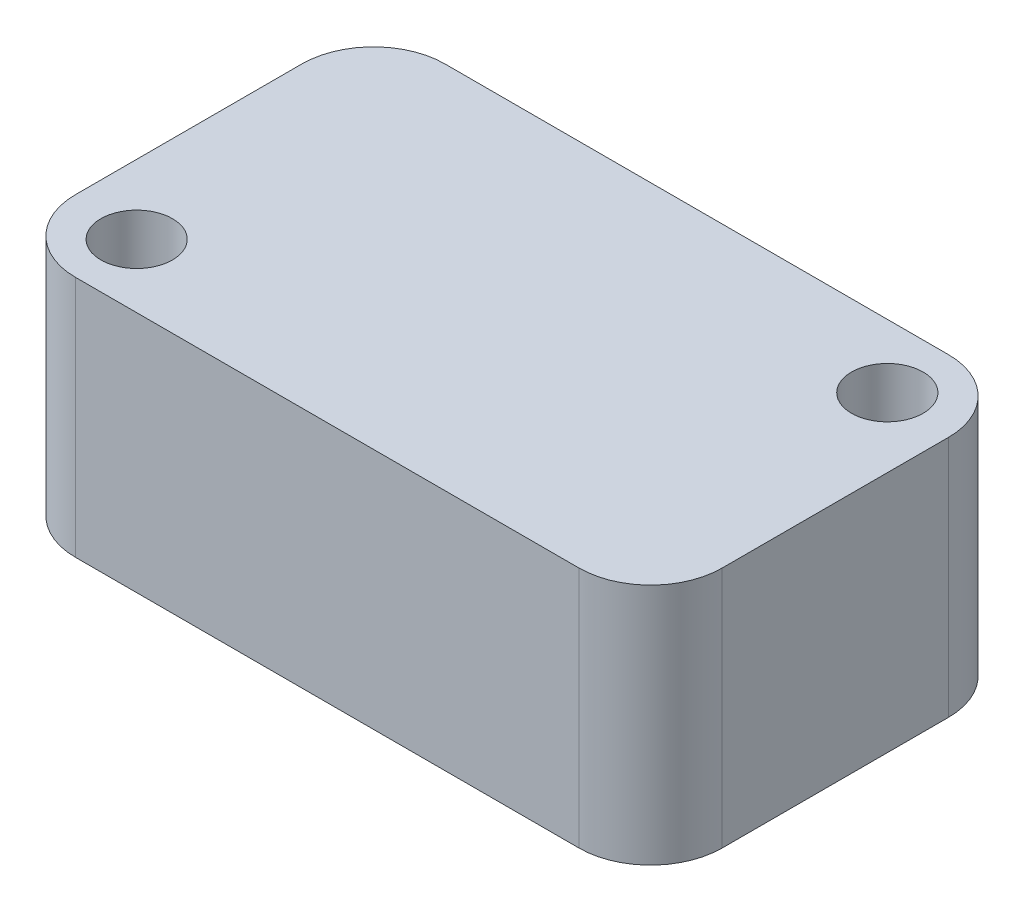
ISO-10303-21;
HEADER;
FILE_DESCRIPTION(('STEP AP214'),'2;1');
FILE_NAME('part.step','',(''),(''),'','','');
FILE_SCHEMA(('AUTOMOTIVE_DESIGN { 1 0 10303 214 1 1 1 1 }'));
ENDSEC;
DATA;
#1=APPLICATION_CONTEXT('core data for automotive mechanical design processes');
#2=APPLICATION_PROTOCOL_DEFINITION('international standard','automotive_design',2000,#1);
#3=PRODUCT_CONTEXT('',#1,'mechanical');
#4=PRODUCT('Part','Part','',(#3));
#5=PRODUCT_RELATED_PRODUCT_CATEGORY('part','',(#4));
#6=PRODUCT_DEFINITION_FORMATION('','',#4);
#7=PRODUCT_DEFINITION_CONTEXT('part definition',#1,'design');
#8=PRODUCT_DEFINITION('design','',#6,#7);
#9=PRODUCT_DEFINITION_SHAPE('','',#8);
#10=(LENGTH_UNIT() NAMED_UNIT(*) SI_UNIT(.MILLI.,.METRE.));
#11=(NAMED_UNIT(*) PLANE_ANGLE_UNIT() SI_UNIT($,.RADIAN.));
#12=(NAMED_UNIT(*) SI_UNIT($,.STERADIAN.) SOLID_ANGLE_UNIT());
#13=UNCERTAINTY_MEASURE_WITH_UNIT(LENGTH_MEASURE(1.E-05),#10,'distance_accuracy_value','');
#14=(GEOMETRIC_REPRESENTATION_CONTEXT(3) GLOBAL_UNCERTAINTY_ASSIGNED_CONTEXT((#13)) GLOBAL_UNIT_ASSIGNED_CONTEXT((#10,
#11,#12)) REPRESENTATION_CONTEXT('',''));
#15=CARTESIAN_POINT('',(0.,0.,0.));
#16=DIRECTION('',(0.,0.,1.));
#17=DIRECTION('',(1.,0.,0.));
#18=AXIS2_PLACEMENT_3D('',#15,#16,#17);
#19=CARTESIAN_POINT('',(10.9,10.5,-4.9));
#20=DIRECTION('',(0.,1.,0.));
#21=DIRECTION('',(0.,0.,1.));
#22=AXIS2_PLACEMENT_3D('',#19,#20,#21);
#23=PLANE('',#22);
#24=CARTESIAN_POINT('',(10.9999999999999,10.5,-5.25));
#25=DIRECTION('',(0.,1.,0.));
#26=DIRECTION('',(0.,0.,1.));
#27=AXIS2_PLACEMENT_3D('',#24,#25,#26);
#28=CIRCLE('',#27,1.55);
#29=CARTESIAN_POINT('',(10.9999999999999,10.5,-6.8));
#30=VERTEX_POINT('',#29);
#31=EDGE_CURVE('E134',#30,#30,#28,.T.);
#32=ORIENTED_EDGE('',*,*,#31,.F.);
#33=EDGE_LOOP('',(#32));
#34=FACE_BOUND('',#33,.T.);
#35=CARTESIAN_POINT('',(10.9,10.5,-4.9));
#36=DIRECTION('',(0.,1.,0.));
#37=DIRECTION('',(0.,0.,1.));
#38=AXIS2_PLACEMENT_3D('',#35,#36,#37);
#39=CIRCLE('',#38,3.1);
#40=CARTESIAN_POINT('',(14.,10.5,-4.9));
#41=VERTEX_POINT('',#40);
#42=CARTESIAN_POINT('',(10.9,10.5,-8.));
#43=VERTEX_POINT('',#42);
#44=EDGE_CURVE('E145',#41,#43,#39,.T.);
#45=ORIENTED_EDGE('',*,*,#44,.T.);
#46=DIRECTION('',(-1.,0.,0.));
#47=VECTOR('',#46,1.);
#48=CARTESIAN_POINT('',(-10.9,10.5,-8.));
#49=LINE('',#48,#47);
#50=CARTESIAN_POINT('',(-10.9,10.5,-8.));
#51=VERTEX_POINT('',#50);
#52=EDGE_CURVE('E93',#43,#51,#49,.T.);
#53=ORIENTED_EDGE('',*,*,#52,.T.);
#54=CARTESIAN_POINT('',(-10.9,10.5,-4.9));
#55=DIRECTION('',(0.,1.,0.));
#56=DIRECTION('',(0.,0.,-1.));
#57=AXIS2_PLACEMENT_3D('',#54,#55,#56);
#58=CIRCLE('',#57,3.1);
#59=CARTESIAN_POINT('',(-14.,10.5,-4.9));
#60=VERTEX_POINT('',#59);
#61=EDGE_CURVE('E160',#51,#60,#58,.T.);
#62=ORIENTED_EDGE('',*,*,#61,.T.);
#63=DIRECTION('',(0.,0.,1.));
#64=VECTOR('',#63,1.);
#65=CARTESIAN_POINT('',(-14.,10.5,4.9));
#66=LINE('',#65,#64);
#67=CARTESIAN_POINT('',(-14.,10.5,4.9));
#68=VERTEX_POINT('',#67);
#69=EDGE_CURVE('E173',#60,#68,#66,.T.);
#70=ORIENTED_EDGE('',*,*,#69,.T.);
#71=CARTESIAN_POINT('',(-10.9,10.5,4.9));
#72=DIRECTION('',(0.,1.,0.));
#73=DIRECTION('',(0.,0.,1.));
#74=AXIS2_PLACEMENT_3D('',#71,#72,#73);
#75=CIRCLE('',#74,3.1);
#76=CARTESIAN_POINT('',(-10.9,10.5,8.));
#77=VERTEX_POINT('',#76);
#78=EDGE_CURVE('E112',#68,#77,#75,.T.);
#79=ORIENTED_EDGE('',*,*,#78,.T.);
#80=DIRECTION('',(1.,0.,0.));
#81=VECTOR('',#80,1.);
#82=CARTESIAN_POINT('',(-10.9,10.5,8.));
#83=LINE('',#82,#81);
#84=CARTESIAN_POINT('',(10.9,10.5,8.));
#85=VERTEX_POINT('',#84);
#86=EDGE_CURVE('E106',#77,#85,#83,.T.);
#87=ORIENTED_EDGE('',*,*,#86,.T.);
#88=CARTESIAN_POINT('',(10.9,10.5,4.9));
#89=DIRECTION('',(0.,1.,0.));
#90=DIRECTION('',(0.,0.,1.));
#91=AXIS2_PLACEMENT_3D('',#88,#89,#90);
#92=CIRCLE('',#91,3.1);
#93=CARTESIAN_POINT('',(14.,10.5,4.9));
#94=VERTEX_POINT('',#93);
#95=EDGE_CURVE('E110',#85,#94,#92,.T.);
#96=ORIENTED_EDGE('',*,*,#95,.T.);
#97=DIRECTION('',(0.,0.,-1.));
#98=VECTOR('',#97,1.);
#99=CARTESIAN_POINT('',(14.,10.5,4.9));
#100=LINE('',#99,#98);
#101=EDGE_CURVE('E50',#94,#41,#100,.T.);
#102=ORIENTED_EDGE('',*,*,#101,.T.);
#103=EDGE_LOOP('',(#45,#53,#62,#70,#79,#87,#96,#102));
#104=FACE_BOUND('',#103,.T.);
#105=CARTESIAN_POINT('',(-10.9999999999999,10.5,5.25));
#106=DIRECTION('',(0.,1.,0.));
#107=DIRECTION('',(0.,0.,1.));
#108=AXIS2_PLACEMENT_3D('',#105,#106,#107);
#109=CIRCLE('',#108,1.55);
#110=CARTESIAN_POINT('',(-10.9999999999999,10.5,3.69999999999999));
#111=VERTEX_POINT('',#110);
#112=EDGE_CURVE('E182',#111,#111,#109,.T.);
#113=ORIENTED_EDGE('',*,*,#112,.F.);
#114=EDGE_LOOP('',(#113));
#115=FACE_BOUND('',#114,.T.);
#116=ADVANCED_FACE('F33',(#34,#104,#115),#23,.T.);
#117=CARTESIAN_POINT('',(10.9,0.,-4.9));
#118=DIRECTION('',(0.,1.,0.));
#119=DIRECTION('',(0.,0.,1.));
#120=AXIS2_PLACEMENT_3D('',#117,#118,#119);
#121=PLANE('',#120);
#122=CARTESIAN_POINT('',(10.9,0.,-4.9));
#123=DIRECTION('',(0.,1.,0.));
#124=DIRECTION('',(0.,0.,1.));
#125=AXIS2_PLACEMENT_3D('',#122,#123,#124);
#126=CIRCLE('',#125,3.1);
#127=CARTESIAN_POINT('',(14.,0.,-4.9));
#128=VERTEX_POINT('',#127);
#129=CARTESIAN_POINT('',(10.9,0.,-8.));
#130=VERTEX_POINT('',#129);
#131=EDGE_CURVE('E130',#128,#130,#126,.T.);
#132=ORIENTED_EDGE('',*,*,#131,.F.);
#133=DIRECTION('',(0.,0.,-1.));
#134=VECTOR('',#133,1.);
#135=CARTESIAN_POINT('',(14.,0.,4.9));
#136=LINE('',#135,#134);
#137=CARTESIAN_POINT('',(14.,0.,4.9));
#138=VERTEX_POINT('',#137);
#139=EDGE_CURVE('E85',#138,#128,#136,.T.);
#140=ORIENTED_EDGE('',*,*,#139,.F.);
#141=CARTESIAN_POINT('',(10.9,0.,4.9));
#142=DIRECTION('',(0.,1.,0.));
#143=DIRECTION('',(0.,0.,1.));
#144=AXIS2_PLACEMENT_3D('',#141,#142,#143);
#145=CIRCLE('',#144,3.1);
#146=CARTESIAN_POINT('',(10.9,0.,8.));
#147=VERTEX_POINT('',#146);
#148=EDGE_CURVE('E79',#147,#138,#145,.T.);
#149=ORIENTED_EDGE('',*,*,#148,.F.);
#150=DIRECTION('',(1.,0.,0.));
#151=VECTOR('',#150,1.);
#152=CARTESIAN_POINT('',(-10.9,0.,8.));
#153=LINE('',#152,#151);
#154=CARTESIAN_POINT('',(-10.9,0.,8.));
#155=VERTEX_POINT('',#154);
#156=EDGE_CURVE('E120',#155,#147,#153,.T.);
#157=ORIENTED_EDGE('',*,*,#156,.F.);
#158=CARTESIAN_POINT('',(-10.9,0.,4.9));
#159=DIRECTION('',(0.,1.,0.));
#160=DIRECTION('',(0.,0.,1.));
#161=AXIS2_PLACEMENT_3D('',#158,#159,#160);
#162=CIRCLE('',#161,3.1);
#163=CARTESIAN_POINT('',(-14.,0.,4.9));
#164=VERTEX_POINT('',#163);
#165=EDGE_CURVE('E140',#164,#155,#162,.T.);
#166=ORIENTED_EDGE('',*,*,#165,.F.);
#167=DIRECTION('',(0.,0.,1.));
#168=VECTOR('',#167,1.);
#169=CARTESIAN_POINT('',(-14.,0.,4.9));
#170=LINE('',#169,#168);
#171=CARTESIAN_POINT('',(-14.,0.,-4.9));
#172=VERTEX_POINT('',#171);
#173=EDGE_CURVE('E138',#172,#164,#170,.T.);
#174=ORIENTED_EDGE('',*,*,#173,.F.);
#175=CARTESIAN_POINT('',(-10.9,0.,-4.9));
#176=DIRECTION('',(0.,1.,0.));
#177=DIRECTION('',(0.,0.,-1.));
#178=AXIS2_PLACEMENT_3D('',#175,#176,#177);
#179=CIRCLE('',#178,3.1);
#180=CARTESIAN_POINT('',(-10.9,0.,-8.));
#181=VERTEX_POINT('',#180);
#182=EDGE_CURVE('E136',#181,#172,#179,.T.);
#183=ORIENTED_EDGE('',*,*,#182,.F.);
#184=DIRECTION('',(-1.,0.,0.));
#185=VECTOR('',#184,1.);
#186=CARTESIAN_POINT('',(-10.9,0.,-8.));
#187=LINE('',#186,#185);
#188=EDGE_CURVE('E133',#130,#181,#187,.T.);
#189=ORIENTED_EDGE('',*,*,#188,.F.);
#190=EDGE_LOOP('',(#132,#140,#149,#157,#166,#174,#183,#189));
#191=FACE_BOUND('',#190,.T.);
#192=CARTESIAN_POINT('',(10.9999999999999,0.,-5.25));
#193=DIRECTION('',(0.,1.,0.));
#194=DIRECTION('',(0.,0.,1.));
#195=AXIS2_PLACEMENT_3D('',#192,#193,#194);
#196=CIRCLE('',#195,1.55);
#197=CARTESIAN_POINT('',(10.9999999999999,0.,-6.8));
#198=VERTEX_POINT('',#197);
#199=EDGE_CURVE('E179',#198,#198,#196,.T.);
#200=ORIENTED_EDGE('',*,*,#199,.T.);
#201=EDGE_LOOP('',(#200));
#202=FACE_BOUND('',#201,.T.);
#203=CARTESIAN_POINT('',(-10.9999999999999,0.,5.25));
#204=DIRECTION('',(0.,1.,0.));
#205=DIRECTION('',(0.,0.,1.));
#206=AXIS2_PLACEMENT_3D('',#203,#204,#205);
#207=CIRCLE('',#206,1.55);
#208=CARTESIAN_POINT('',(-10.9999999999999,0.,3.69999999999999));
#209=VERTEX_POINT('',#208);
#210=EDGE_CURVE('E185',#209,#209,#207,.T.);
#211=ORIENTED_EDGE('',*,*,#210,.T.);
#212=EDGE_LOOP('',(#211));
#213=FACE_BOUND('',#212,.T.);
#214=ADVANCED_FACE('F164',(#191,#202,#213),#121,.F.);
#215=CARTESIAN_POINT('',(10.9,10.5,-4.9));
#216=DIRECTION('',(0.,-1.,0.));
#217=DIRECTION('',(0.,0.,-1.));
#218=AXIS2_PLACEMENT_3D('',#215,#216,#217);
#219=CYLINDRICAL_SURFACE('',#218,3.1);
#220=ORIENTED_EDGE('',*,*,#131,.T.);
#221=DIRECTION('',(0.,-1.,0.));
#222=VECTOR('',#221,1.);
#223=CARTESIAN_POINT('',(10.9,10.5,-8.));
#224=LINE('',#223,#222);
#225=EDGE_CURVE('E11',#43,#130,#224,.T.);
#226=ORIENTED_EDGE('',*,*,#225,.F.);
#227=ORIENTED_EDGE('',*,*,#44,.F.);
#228=DIRECTION('',(0.,-1.,0.));
#229=VECTOR('',#228,1.);
#230=CARTESIAN_POINT('',(14.,10.5,-4.9));
#231=LINE('',#230,#229);
#232=EDGE_CURVE('E126',#41,#128,#231,.T.);
#233=ORIENTED_EDGE('',*,*,#232,.T.);
#234=EDGE_LOOP('',(#220,#226,#227,#233));
#235=FACE_BOUND('',#234,.T.);
#236=ADVANCED_FACE('F35',(#235),#219,.T.);
#237=CARTESIAN_POINT('',(-10.9,10.5,-8.));
#238=DIRECTION('',(0.,0.,1.));
#239=DIRECTION('',(1.,0.,0.));
#240=AXIS2_PLACEMENT_3D('',#237,#238,#239);
#241=PLANE('',#240);
#242=ORIENTED_EDGE('',*,*,#188,.T.);
#243=DIRECTION('',(0.,-1.,0.));
#244=VECTOR('',#243,1.);
#245=CARTESIAN_POINT('',(-10.9,10.5,-8.));
#246=LINE('',#245,#244);
#247=EDGE_CURVE('E42',#51,#181,#246,.T.);
#248=ORIENTED_EDGE('',*,*,#247,.F.);
#249=ORIENTED_EDGE('',*,*,#52,.F.);
#250=ORIENTED_EDGE('',*,*,#225,.T.);
#251=EDGE_LOOP('',(#242,#248,#249,#250));
#252=FACE_BOUND('',#251,.T.);
#253=ADVANCED_FACE('F217',(#252),#241,.F.);
#254=CARTESIAN_POINT('',(-10.9,10.5,-4.9));
#255=DIRECTION('',(0.,-1.,0.));
#256=DIRECTION('',(0.,0.,-1.));
#257=AXIS2_PLACEMENT_3D('',#254,#255,#256);
#258=CYLINDRICAL_SURFACE('',#257,3.1);
#259=ORIENTED_EDGE('',*,*,#182,.T.);
#260=DIRECTION('',(0.,-1.,0.));
#261=VECTOR('',#260,1.);
#262=CARTESIAN_POINT('',(-14.,10.5,-4.9));
#263=LINE('',#262,#261);
#264=EDGE_CURVE('E152',#60,#172,#263,.T.);
#265=ORIENTED_EDGE('',*,*,#264,.F.);
#266=ORIENTED_EDGE('',*,*,#61,.F.);
#267=ORIENTED_EDGE('',*,*,#247,.T.);
#268=EDGE_LOOP('',(#259,#265,#266,#267));
#269=FACE_BOUND('',#268,.T.);
#270=ADVANCED_FACE('F158',(#269),#258,.T.);
#271=CARTESIAN_POINT('',(-14.,10.5,4.9));
#272=DIRECTION('',(1.,0.,0.));
#273=DIRECTION('',(0.,0.,-1.));
#274=AXIS2_PLACEMENT_3D('',#271,#272,#273);
#275=PLANE('',#274);
#276=ORIENTED_EDGE('',*,*,#173,.T.);
#277=DIRECTION('',(0.,-1.,0.));
#278=VECTOR('',#277,1.);
#279=CARTESIAN_POINT('',(-14.,10.5,4.9));
#280=LINE('',#279,#278);
#281=EDGE_CURVE('E149',#68,#164,#280,.T.);
#282=ORIENTED_EDGE('',*,*,#281,.F.);
#283=ORIENTED_EDGE('',*,*,#69,.F.);
#284=ORIENTED_EDGE('',*,*,#264,.T.);
#285=EDGE_LOOP('',(#276,#282,#283,#284));
#286=FACE_BOUND('',#285,.T.);
#287=ADVANCED_FACE('F169',(#286),#275,.F.);
#288=CARTESIAN_POINT('',(-10.9,10.5,4.9));
#289=DIRECTION('',(0.,-1.,0.));
#290=DIRECTION('',(0.,0.,-1.));
#291=AXIS2_PLACEMENT_3D('',#288,#289,#290);
#292=CYLINDRICAL_SURFACE('',#291,3.1);
#293=ORIENTED_EDGE('',*,*,#165,.T.);
#294=DIRECTION('',(0.,-1.,0.));
#295=VECTOR('',#294,1.);
#296=CARTESIAN_POINT('',(-10.9,10.5,8.));
#297=LINE('',#296,#295);
#298=EDGE_CURVE('E121',#77,#155,#297,.T.);
#299=ORIENTED_EDGE('',*,*,#298,.F.);
#300=ORIENTED_EDGE('',*,*,#78,.F.);
#301=ORIENTED_EDGE('',*,*,#281,.T.);
#302=EDGE_LOOP('',(#293,#299,#300,#301));
#303=FACE_BOUND('',#302,.T.);
#304=ADVANCED_FACE('F172',(#303),#292,.T.);
#305=CARTESIAN_POINT('',(-10.9,10.5,8.));
#306=DIRECTION('',(0.,0.,-1.));
#307=DIRECTION('',(-1.,0.,0.));
#308=AXIS2_PLACEMENT_3D('',#305,#306,#307);
#309=PLANE('',#308);
#310=ORIENTED_EDGE('',*,*,#156,.T.);
#311=DIRECTION('',(0.,-1.,0.));
#312=VECTOR('',#311,1.);
#313=CARTESIAN_POINT('',(10.9,10.5,8.));
#314=LINE('',#313,#312);
#315=EDGE_CURVE('E117',#85,#147,#314,.T.);
#316=ORIENTED_EDGE('',*,*,#315,.F.);
#317=ORIENTED_EDGE('',*,*,#86,.F.);
#318=ORIENTED_EDGE('',*,*,#298,.T.);
#319=EDGE_LOOP('',(#310,#316,#317,#318));
#320=FACE_BOUND('',#319,.T.);
#321=ADVANCED_FACE('F118',(#320),#309,.F.);
#322=CARTESIAN_POINT('',(10.9,10.5,4.9));
#323=DIRECTION('',(0.,-1.,0.));
#324=DIRECTION('',(0.,0.,-1.));
#325=AXIS2_PLACEMENT_3D('',#322,#323,#324);
#326=CYLINDRICAL_SURFACE('',#325,3.1);
#327=ORIENTED_EDGE('',*,*,#148,.T.);
#328=DIRECTION('',(0.,-1.,0.));
#329=VECTOR('',#328,1.);
#330=CARTESIAN_POINT('',(14.,10.5,4.9));
#331=LINE('',#330,#329);
#332=EDGE_CURVE('E122',#94,#138,#331,.T.);
#333=ORIENTED_EDGE('',*,*,#332,.F.);
#334=ORIENTED_EDGE('',*,*,#95,.F.);
#335=ORIENTED_EDGE('',*,*,#315,.T.);
#336=EDGE_LOOP('',(#327,#333,#334,#335));
#337=FACE_BOUND('',#336,.T.);
#338=ADVANCED_FACE('F124',(#337),#326,.T.);
#339=CARTESIAN_POINT('',(14.,10.5,4.9));
#340=DIRECTION('',(-1.,0.,0.));
#341=DIRECTION('',(0.,0.,1.));
#342=AXIS2_PLACEMENT_3D('',#339,#340,#341);
#343=PLANE('',#342);
#344=ORIENTED_EDGE('',*,*,#139,.T.);
#345=ORIENTED_EDGE('',*,*,#232,.F.);
#346=ORIENTED_EDGE('',*,*,#101,.F.);
#347=ORIENTED_EDGE('',*,*,#332,.T.);
#348=EDGE_LOOP('',(#344,#345,#346,#347));
#349=FACE_BOUND('',#348,.T.);
#350=ADVANCED_FACE('F205',(#349),#343,.F.);
#351=CARTESIAN_POINT('',(10.9999999999999,10.5,-5.25));
#352=DIRECTION('',(0.,-1.,0.));
#353=DIRECTION('',(0.,0.,-1.));
#354=AXIS2_PLACEMENT_3D('',#351,#352,#353);
#355=CYLINDRICAL_SURFACE('',#354,1.55);
#356=CARTESIAN_POINT('',(10.9999999999999,10.5,-6.8));
#357=CARTESIAN_POINT('',(10.9999999999999,10.390625,-6.8));
#358=CARTESIAN_POINT('',(10.9999999999999,10.28125,-6.8));
#359=CARTESIAN_POINT('',(10.9999999999999,10.0625,-6.8));
#360=CARTESIAN_POINT('',(10.9999999999999,9.953125,-6.8));
#361=CARTESIAN_POINT('',(10.9999999999999,9.734375,-6.8));
#362=CARTESIAN_POINT('',(10.9999999999999,9.625,-6.8));
#363=CARTESIAN_POINT('',(10.9999999999999,9.40625,-6.8));
#364=CARTESIAN_POINT('',(10.9999999999999,9.296875,-6.8));
#365=CARTESIAN_POINT('',(10.9999999999999,9.078125,-6.8));
#366=CARTESIAN_POINT('',(10.9999999999999,8.96875,-6.8));
#367=CARTESIAN_POINT('',(10.9999999999999,8.75,-6.8));
#368=CARTESIAN_POINT('',(10.9999999999999,8.640625,-6.8));
#369=CARTESIAN_POINT('',(10.9999999999999,8.421875,-6.8));
#370=CARTESIAN_POINT('',(10.9999999999999,8.3125,-6.8));
#371=CARTESIAN_POINT('',(10.9999999999999,8.09375,-6.8));
#372=CARTESIAN_POINT('',(10.9999999999999,7.984375,-6.8));
#373=CARTESIAN_POINT('',(10.9999999999999,7.765625,-6.8));
#374=CARTESIAN_POINT('',(10.9999999999999,7.65625,-6.8));
#375=CARTESIAN_POINT('',(10.9999999999999,7.4375,-6.8));
#376=CARTESIAN_POINT('',(10.9999999999999,7.328125,-6.8));
#377=CARTESIAN_POINT('',(10.9999999999999,7.109375,-6.8));
#378=CARTESIAN_POINT('',(10.9999999999999,7.,-6.8));
#379=CARTESIAN_POINT('',(10.9999999999999,6.78125,-6.8));
#380=CARTESIAN_POINT('',(10.9999999999999,6.671875,-6.8));
#381=CARTESIAN_POINT('',(10.9999999999999,6.453125,-6.8));
#382=CARTESIAN_POINT('',(10.9999999999999,6.34375,-6.8));
#383=CARTESIAN_POINT('',(10.9999999999999,6.125,-6.8));
#384=CARTESIAN_POINT('',(10.9999999999999,6.015625,-6.8));
#385=CARTESIAN_POINT('',(10.9999999999999,5.796875,-6.8));
#386=CARTESIAN_POINT('',(10.9999999999999,5.6875,-6.8));
#387=CARTESIAN_POINT('',(10.9999999999999,5.46875,-6.8));
#388=CARTESIAN_POINT('',(10.9999999999999,5.359375,-6.8));
#389=CARTESIAN_POINT('',(10.9999999999999,5.140625,-6.8));
#390=CARTESIAN_POINT('',(10.9999999999999,5.03125,-6.8));
#391=CARTESIAN_POINT('',(10.9999999999999,4.8125,-6.8));
#392=CARTESIAN_POINT('',(10.9999999999999,4.703125,-6.8));
#393=CARTESIAN_POINT('',(10.9999999999999,4.484375,-6.8));
#394=CARTESIAN_POINT('',(10.9999999999999,4.375,-6.8));
#395=CARTESIAN_POINT('',(10.9999999999999,4.15625,-6.8));
#396=CARTESIAN_POINT('',(10.9999999999999,4.046875,-6.8));
#397=CARTESIAN_POINT('',(10.9999999999999,3.828125,-6.8));
#398=CARTESIAN_POINT('',(10.9999999999999,3.71875,-6.8));
#399=CARTESIAN_POINT('',(10.9999999999999,3.5,-6.8));
#400=CARTESIAN_POINT('',(10.9999999999999,3.390625,-6.8));
#401=CARTESIAN_POINT('',(10.9999999999999,3.171875,-6.8));
#402=CARTESIAN_POINT('',(10.9999999999999,3.0625,-6.8));
#403=CARTESIAN_POINT('',(10.9999999999999,2.84375,-6.8));
#404=CARTESIAN_POINT('',(10.9999999999999,2.734375,-6.8));
#405=CARTESIAN_POINT('',(10.9999999999999,2.515625,-6.8));
#406=CARTESIAN_POINT('',(10.9999999999999,2.40625,-6.8));
#407=CARTESIAN_POINT('',(10.9999999999999,2.1875,-6.8));
#408=CARTESIAN_POINT('',(10.9999999999999,2.078125,-6.8));
#409=CARTESIAN_POINT('',(10.9999999999999,1.859375,-6.8));
#410=CARTESIAN_POINT('',(10.9999999999999,1.75,-6.8));
#411=CARTESIAN_POINT('',(10.9999999999999,1.53125,-6.8));
#412=CARTESIAN_POINT('',(10.9999999999999,1.421875,-6.8));
#413=CARTESIAN_POINT('',(10.9999999999999,1.203125,-6.8));
#414=CARTESIAN_POINT('',(10.9999999999999,1.09375,-6.8));
#415=CARTESIAN_POINT('',(10.9999999999999,0.875000000000001,-6.8));
#416=CARTESIAN_POINT('',(10.9999999999999,0.765625000000001,-6.8));
#417=CARTESIAN_POINT('',(10.9999999999999,0.546875,-6.8));
#418=CARTESIAN_POINT('',(10.9999999999999,0.4375,-6.8));
#419=CARTESIAN_POINT('',(10.9999999999999,0.21875,-6.8));
#420=CARTESIAN_POINT('',(10.9999999999999,0.109375,-6.8));
#421=CARTESIAN_POINT('',(10.9999999999999,0.,-6.8));
#422=B_SPLINE_CURVE_WITH_KNOTS('',3,(#356,#357,#358,#359,#360,#361,#362,#363,#364,#365,#366,
#367,#368,#369,#370,#371,#372,#373,#374,#375,#376,#377,#378,#379,#380,#381,#382,#383,#384,#385,
#386,#387,#388,#389,#390,#391,#392,#393,#394,#395,#396,#397,#398,#399,#400,#401,#402,#403,#404,
#405,#406,#407,#408,#409,#410,#411,#412,#413,#414,#415,#416,#417,#418,#419,#420,#421),
.UNSPECIFIED.,.F.,.F.,(4,2,2,2,2,2,2,2,2,2,2,2,2,2,2,2,2,2,2,2,2,2,2,2,2,2,2,2,2,2,2,2,4),(0.,
0.328125,0.656250000000001,0.984375000000001,1.3125,1.640625,1.96875,2.296875,2.625,2.953125,
3.28125,3.609375,3.9375,4.265625,4.59375,4.921875,5.25,5.578125,5.90625,6.234375,6.5625,
6.890625,7.21875,7.546875,7.875,8.203125,8.53125,8.859375,9.1875,9.515625,9.84375,10.171875,
10.5),.UNSPECIFIED.);
#423=EDGE_CURVE('BSEAM202',#30,#198,#422,.T.);
#424=ORIENTED_EDGE('',*,*,#31,.T.);
#425=ORIENTED_EDGE('',*,*,#199,.F.);
#426=ORIENTED_EDGE('',*,*,#423,.T.);
#427=ORIENTED_EDGE('',*,*,#423,.F.);
#428=EDGE_LOOP('',(#424,#426,#425,#427));
#429=FACE_BOUND('',#428,.T.);
#430=ADVANCED_FACE('F202',(#429),#355,.F.);
#431=CARTESIAN_POINT('',(-10.9999999999999,10.5,5.25));
#432=DIRECTION('',(0.,-1.,0.));
#433=DIRECTION('',(0.,0.,-1.));
#434=AXIS2_PLACEMENT_3D('',#431,#432,#433);
#435=CYLINDRICAL_SURFACE('',#434,1.55);
#436=CARTESIAN_POINT('',(-10.9999999999999,10.5,3.69999999999999));
#437=CARTESIAN_POINT('',(-10.9999999999999,10.390625,3.69999999999999));
#438=CARTESIAN_POINT('',(-10.9999999999999,10.28125,3.69999999999999));
#439=CARTESIAN_POINT('',(-10.9999999999999,10.0625,3.69999999999999));
#440=CARTESIAN_POINT('',(-10.9999999999999,9.953125,3.69999999999999));
#441=CARTESIAN_POINT('',(-10.9999999999999,9.734375,3.69999999999999));
#442=CARTESIAN_POINT('',(-10.9999999999999,9.625,3.69999999999999));
#443=CARTESIAN_POINT('',(-10.9999999999999,9.40625,3.69999999999999));
#444=CARTESIAN_POINT('',(-10.9999999999999,9.296875,3.69999999999999));
#445=CARTESIAN_POINT('',(-10.9999999999999,9.078125,3.69999999999999));
#446=CARTESIAN_POINT('',(-10.9999999999999,8.96875,3.69999999999999));
#447=CARTESIAN_POINT('',(-10.9999999999999,8.75,3.69999999999999));
#448=CARTESIAN_POINT('',(-10.9999999999999,8.640625,3.69999999999999));
#449=CARTESIAN_POINT('',(-10.9999999999999,8.421875,3.69999999999999));
#450=CARTESIAN_POINT('',(-10.9999999999999,8.3125,3.69999999999999));
#451=CARTESIAN_POINT('',(-10.9999999999999,8.09375,3.69999999999999));
#452=CARTESIAN_POINT('',(-10.9999999999999,7.984375,3.69999999999999));
#453=CARTESIAN_POINT('',(-10.9999999999999,7.765625,3.69999999999999));
#454=CARTESIAN_POINT('',(-10.9999999999999,7.65625,3.69999999999999));
#455=CARTESIAN_POINT('',(-10.9999999999999,7.4375,3.69999999999999));
#456=CARTESIAN_POINT('',(-10.9999999999999,7.328125,3.69999999999999));
#457=CARTESIAN_POINT('',(-10.9999999999999,7.109375,3.69999999999999));
#458=CARTESIAN_POINT('',(-10.9999999999999,7.,3.69999999999999));
#459=CARTESIAN_POINT('',(-10.9999999999999,6.78125,3.69999999999999));
#460=CARTESIAN_POINT('',(-10.9999999999999,6.671875,3.69999999999999));
#461=CARTESIAN_POINT('',(-10.9999999999999,6.453125,3.69999999999999));
#462=CARTESIAN_POINT('',(-10.9999999999999,6.34375,3.69999999999999));
#463=CARTESIAN_POINT('',(-10.9999999999999,6.125,3.69999999999999));
#464=CARTESIAN_POINT('',(-10.9999999999999,6.015625,3.69999999999999));
#465=CARTESIAN_POINT('',(-10.9999999999999,5.796875,3.69999999999999));
#466=CARTESIAN_POINT('',(-10.9999999999999,5.6875,3.69999999999999));
#467=CARTESIAN_POINT('',(-10.9999999999999,5.46875,3.69999999999999));
#468=CARTESIAN_POINT('',(-10.9999999999999,5.359375,3.69999999999999));
#469=CARTESIAN_POINT('',(-10.9999999999999,5.140625,3.69999999999999));
#470=CARTESIAN_POINT('',(-10.9999999999999,5.03125,3.69999999999999));
#471=CARTESIAN_POINT('',(-10.9999999999999,4.8125,3.69999999999999));
#472=CARTESIAN_POINT('',(-10.9999999999999,4.703125,3.69999999999999));
#473=CARTESIAN_POINT('',(-10.9999999999999,4.484375,3.69999999999999));
#474=CARTESIAN_POINT('',(-10.9999999999999,4.375,3.69999999999999));
#475=CARTESIAN_POINT('',(-10.9999999999999,4.15625,3.69999999999999));
#476=CARTESIAN_POINT('',(-10.9999999999999,4.046875,3.69999999999999));
#477=CARTESIAN_POINT('',(-10.9999999999999,3.828125,3.69999999999999));
#478=CARTESIAN_POINT('',(-10.9999999999999,3.71875,3.69999999999999));
#479=CARTESIAN_POINT('',(-10.9999999999999,3.5,3.69999999999999));
#480=CARTESIAN_POINT('',(-10.9999999999999,3.390625,3.69999999999999));
#481=CARTESIAN_POINT('',(-10.9999999999999,3.171875,3.69999999999999));
#482=CARTESIAN_POINT('',(-10.9999999999999,3.0625,3.69999999999999));
#483=CARTESIAN_POINT('',(-10.9999999999999,2.84375,3.69999999999999));
#484=CARTESIAN_POINT('',(-10.9999999999999,2.734375,3.69999999999999));
#485=CARTESIAN_POINT('',(-10.9999999999999,2.515625,3.69999999999999));
#486=CARTESIAN_POINT('',(-10.9999999999999,2.40625,3.69999999999999));
#487=CARTESIAN_POINT('',(-10.9999999999999,2.1875,3.69999999999999));
#488=CARTESIAN_POINT('',(-10.9999999999999,2.078125,3.69999999999999));
#489=CARTESIAN_POINT('',(-10.9999999999999,1.859375,3.69999999999999));
#490=CARTESIAN_POINT('',(-10.9999999999999,1.75,3.69999999999999));
#491=CARTESIAN_POINT('',(-10.9999999999999,1.53125,3.69999999999999));
#492=CARTESIAN_POINT('',(-10.9999999999999,1.421875,3.69999999999999));
#493=CARTESIAN_POINT('',(-10.9999999999999,1.203125,3.69999999999999));
#494=CARTESIAN_POINT('',(-10.9999999999999,1.09375,3.69999999999999));
#495=CARTESIAN_POINT('',(-10.9999999999999,0.875000000000001,3.69999999999999));
#496=CARTESIAN_POINT('',(-10.9999999999999,0.765625000000001,3.69999999999999));
#497=CARTESIAN_POINT('',(-10.9999999999999,0.546875,3.69999999999999));
#498=CARTESIAN_POINT('',(-10.9999999999999,0.4375,3.69999999999999));
#499=CARTESIAN_POINT('',(-10.9999999999999,0.21875,3.69999999999999));
#500=CARTESIAN_POINT('',(-10.9999999999999,0.109375,3.69999999999999));
#501=CARTESIAN_POINT('',(-10.9999999999999,0.,3.69999999999999));
#502=B_SPLINE_CURVE_WITH_KNOTS('',3,(#436,#437,#438,#439,#440,#441,#442,#443,#444,#445,#446,
#447,#448,#449,#450,#451,#452,#453,#454,#455,#456,#457,#458,#459,#460,#461,#462,#463,#464,#465,
#466,#467,#468,#469,#470,#471,#472,#473,#474,#475,#476,#477,#478,#479,#480,#481,#482,#483,#484,
#485,#486,#487,#488,#489,#490,#491,#492,#493,#494,#495,#496,#497,#498,#499,#500,#501),
.UNSPECIFIED.,.F.,.F.,(4,2,2,2,2,2,2,2,2,2,2,2,2,2,2,2,2,2,2,2,2,2,2,2,2,2,2,2,2,2,2,2,4),(0.,
0.328125,0.656250000000001,0.984375000000001,1.3125,1.640625,1.96875,2.296875,2.625,2.953125,
3.28125,3.609375,3.9375,4.265625,4.59375,4.921875,5.25,5.578125,5.90625,6.234375,6.5625,
6.890625,7.21875,7.546875,7.875,8.203125,8.53125,8.859375,9.1875,9.515625,9.84375,10.171875,
10.5),.UNSPECIFIED.);
#503=EDGE_CURVE('BSEAM191',#111,#209,#502,.T.);
#504=ORIENTED_EDGE('',*,*,#112,.T.);
#505=ORIENTED_EDGE('',*,*,#210,.F.);
#506=ORIENTED_EDGE('',*,*,#503,.T.);
#507=ORIENTED_EDGE('',*,*,#503,.F.);
#508=EDGE_LOOP('',(#504,#506,#505,#507));
#509=FACE_BOUND('',#508,.T.);
#510=ADVANCED_FACE('F191',(#509),#435,.F.);
#511=CLOSED_SHELL('',(#116,#214,#236,#253,#270,#287,#304,#321,#338,#350,#430,#510));
#512=MANIFOLD_SOLID_BREP('B2',#511);
#513=ADVANCED_BREP_SHAPE_REPRESENTATION('',(#18,#512),#14);
#514=SHAPE_DEFINITION_REPRESENTATION(#9,#513);
ENDSEC;
END-ISO-10303-21;
